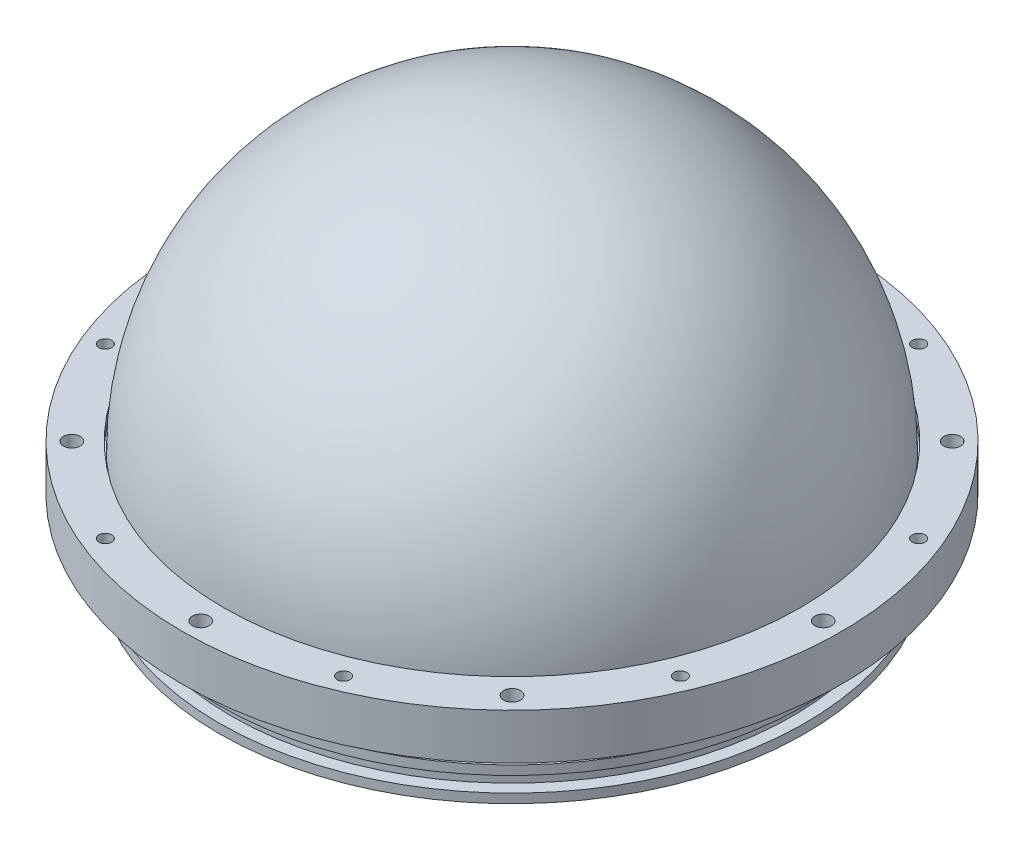
ISO-10303-21;
HEADER;
FILE_DESCRIPTION(('STEP AP214'),'2;1');
FILE_NAME('part.step','',(''),(''),'','','');
FILE_SCHEMA(('AUTOMOTIVE_DESIGN { 1 0 10303 214 1 1 1 1 }'));
ENDSEC;
DATA;
#1=APPLICATION_CONTEXT('core data for automotive mechanical design processes');
#2=APPLICATION_PROTOCOL_DEFINITION('international standard','automotive_design',2000,#1);
#3=PRODUCT_CONTEXT('',#1,'mechanical');
#4=PRODUCT('Part','Part','',(#3));
#5=PRODUCT_RELATED_PRODUCT_CATEGORY('part','',(#4));
#6=PRODUCT_DEFINITION_FORMATION('','',#4);
#7=PRODUCT_DEFINITION_CONTEXT('part definition',#1,'design');
#8=PRODUCT_DEFINITION('design','',#6,#7);
#9=PRODUCT_DEFINITION_SHAPE('','',#8);
#10=(LENGTH_UNIT() NAMED_UNIT(*) SI_UNIT(.MILLI.,.METRE.));
#11=(NAMED_UNIT(*) PLANE_ANGLE_UNIT() SI_UNIT($,.RADIAN.));
#12=(NAMED_UNIT(*) SI_UNIT($,.STERADIAN.) SOLID_ANGLE_UNIT());
#13=UNCERTAINTY_MEASURE_WITH_UNIT(LENGTH_MEASURE(1.E-05),#10,'distance_accuracy_value','');
#14=(GEOMETRIC_REPRESENTATION_CONTEXT(3) GLOBAL_UNCERTAINTY_ASSIGNED_CONTEXT((#13)) GLOBAL_UNIT_ASSIGNED_CONTEXT((#10,
#11,#12)) REPRESENTATION_CONTEXT('',''));
#15=CARTESIAN_POINT('',(0.,0.,0.));
#16=DIRECTION('',(0.,0.,1.));
#17=DIRECTION('',(1.,0.,0.));
#18=AXIS2_PLACEMENT_3D('',#15,#16,#17);
#19=CARTESIAN_POINT('',(0.,14.5,0.));
#20=DIRECTION('',(0.,1.,0.));
#21=DIRECTION('',(1.,0.,0.));
#22=AXIS2_PLACEMENT_3D('',#19,#20,#21);
#23=SPHERICAL_SURFACE('',#22,94.);
#24=CARTESIAN_POINT('',(0.,14.5,0.));
#25=DIRECTION('',(0.,1.,0.));
#26=DIRECTION('',(-1.,0.,0.));
#27=AXIS2_PLACEMENT_3D('',#24,#25,#26);
#28=CIRCLE('',#27,94.);
#29=CARTESIAN_POINT('',(-94.,14.5,0.));
#30=VERTEX_POINT('',#29);
#31=EDGE_CURVE('E11',#30,#30,#28,.T.);
#32=ORIENTED_EDGE('',*,*,#31,.T.);
#33=EDGE_LOOP('',(#32));
#34=FACE_BOUND('',#33,.T.);
#35=ADVANCED_FACE('F41',(#34),#23,.T.);
#36=CARTESIAN_POINT('',(87.65,14.5,0.));
#37=DIRECTION('',(0.,1.,0.));
#38=DIRECTION('',(-1.,0.,0.));
#39=AXIS2_PLACEMENT_3D('',#36,#37,#38);
#40=PLANE('',#39);
#41=ORIENTED_EDGE('',*,*,#31,.F.);
#42=EDGE_LOOP('',(#41));
#43=FACE_BOUND('',#42,.T.);
#44=CARTESIAN_POINT('',(0.,14.5,0.));
#45=DIRECTION('',(0.,1.,0.));
#46=DIRECTION('',(-1.,0.,0.));
#47=AXIS2_PLACEMENT_3D('',#44,#45,#46);
#48=CIRCLE('',#47,87.65);
#49=CARTESIAN_POINT('',(-87.65,14.5,0.));
#50=VERTEX_POINT('',#49);
#51=EDGE_CURVE('E47',#50,#50,#48,.T.);
#52=ORIENTED_EDGE('',*,*,#51,.T.);
#53=EDGE_LOOP('',(#52));
#54=FACE_BOUND('',#53,.T.);
#55=ADVANCED_FACE('F53',(#43,#54),#40,.F.);
#56=CARTESIAN_POINT('',(0.,14.5,0.));
#57=DIRECTION('',(0.,1.,0.));
#58=DIRECTION('',(1.,0.,0.));
#59=AXIS2_PLACEMENT_3D('',#56,#57,#58);
#60=SPHERICAL_SURFACE('',#59,87.65);
#61=ORIENTED_EDGE('',*,*,#51,.F.);
#62=EDGE_LOOP('',(#61));
#63=FACE_BOUND('',#62,.T.);
#64=ADVANCED_FACE('F55',(#63),#60,.F.);
#65=CLOSED_SHELL('',(#35,#55,#64));
#66=MANIFOLD_SOLID_BREP('B2',#65);
#67=CARTESIAN_POINT('',(94.5,17.5,0.));
#68=DIRECTION('',(0.,-1.,0.));
#69=DIRECTION('',(0.,0.,-1.));
#70=AXIS2_PLACEMENT_3D('',#67,#68,#69);
#71=PLANE('',#70);
#72=CARTESIAN_POINT('',(94.2357123161512,17.5,-39.0337101012392));
#73=DIRECTION('',(0.,1.,0.));
#74=DIRECTION('',(0.,0.,1.));
#75=AXIS2_PLACEMENT_3D('',#72,#73,#74);
#76=CIRCLE('',#75,2.1);
#77=CARTESIAN_POINT('',(94.2357123161512,17.5,-36.9337101012392));
#78=VERTEX_POINT('',#77);
#79=EDGE_CURVE('E243',#78,#78,#76,.T.);
#80=ORIENTED_EDGE('',*,*,#79,.F.);
#81=EDGE_LOOP('',(#80));
#82=FACE_BOUND('',#81,.T.);
#83=CARTESIAN_POINT('',(-39.0337101012393,17.5,-94.2357123161512));
#84=DIRECTION('',(0.,1.,0.));
#85=DIRECTION('',(0.,0.,1.));
#86=AXIS2_PLACEMENT_3D('',#83,#84,#85);
#87=CIRCLE('',#86,2.1);
#88=CARTESIAN_POINT('',(-39.0337101012393,17.5,-92.1357123161512));
#89=VERTEX_POINT('',#88);
#90=EDGE_CURVE('E207',#89,#89,#87,.T.);
#91=ORIENTED_EDGE('',*,*,#90,.F.);
#92=EDGE_LOOP('',(#91));
#93=FACE_BOUND('',#92,.T.);
#94=CARTESIAN_POINT('',(39.0337101012391,17.5,-94.2357123161513));
#95=DIRECTION('',(0.,1.,0.));
#96=DIRECTION('',(0.,0.,1.));
#97=AXIS2_PLACEMENT_3D('',#94,#95,#96);
#98=CIRCLE('',#97,2.1);
#99=CARTESIAN_POINT('',(39.0337101012391,17.5,-92.1357123161513));
#100=VERTEX_POINT('',#99);
#101=EDGE_CURVE('E201',#100,#100,#98,.T.);
#102=ORIENTED_EDGE('',*,*,#101,.F.);
#103=EDGE_LOOP('',(#102));
#104=FACE_BOUND('',#103,.T.);
#105=CARTESIAN_POINT('',(102.,17.5,0.));
#106=DIRECTION('',(0.,1.,0.));
#107=DIRECTION('',(0.,0.,1.));
#108=AXIS2_PLACEMENT_3D('',#105,#106,#107);
#109=CIRCLE('',#108,2.75);
#110=CARTESIAN_POINT('',(102.,17.5,2.75000000000003));
#111=VERTEX_POINT('',#110);
#112=EDGE_CURVE('E195',#111,#111,#109,.T.);
#113=ORIENTED_EDGE('',*,*,#112,.F.);
#114=EDGE_LOOP('',(#113));
#115=FACE_BOUND('',#114,.T.);
#116=CARTESIAN_POINT('',(72.1248916810279,17.5,72.1248916810279));
#117=DIRECTION('',(0.,1.,0.));
#118=DIRECTION('',(0.,0.,1.));
#119=AXIS2_PLACEMENT_3D('',#116,#117,#118);
#120=CIRCLE('',#119,2.75);
#121=CARTESIAN_POINT('',(72.1248916810279,17.5,74.8748916810279));
#122=VERTEX_POINT('',#121);
#123=EDGE_CURVE('E189',#122,#122,#120,.T.);
#124=ORIENTED_EDGE('',*,*,#123,.F.);
#125=EDGE_LOOP('',(#124));
#126=FACE_BOUND('',#125,.T.);
#127=CARTESIAN_POINT('',(0.,17.5,102.));
#128=DIRECTION('',(0.,1.,0.));
#129=DIRECTION('',(0.,0.,1.));
#130=AXIS2_PLACEMENT_3D('',#127,#128,#129);
#131=CIRCLE('',#130,2.75);
#132=CARTESIAN_POINT('',(0.,17.5,104.75));
#133=VERTEX_POINT('',#132);
#134=EDGE_CURVE('E183',#133,#133,#131,.T.);
#135=ORIENTED_EDGE('',*,*,#134,.F.);
#136=EDGE_LOOP('',(#135));
#137=FACE_BOUND('',#136,.T.);
#138=CARTESIAN_POINT('',(-102.,17.5,0.));
#139=DIRECTION('',(0.,1.,0.));
#140=DIRECTION('',(0.,0.,1.));
#141=AXIS2_PLACEMENT_3D('',#138,#139,#140);
#142=CIRCLE('',#141,2.75);
#143=CARTESIAN_POINT('',(-102.,17.5,2.75000000000003));
#144=VERTEX_POINT('',#143);
#145=EDGE_CURVE('E171',#144,#144,#142,.T.);
#146=ORIENTED_EDGE('',*,*,#145,.F.);
#147=EDGE_LOOP('',(#146));
#148=FACE_BOUND('',#147,.T.);
#149=CARTESIAN_POINT('',(-72.1248916810279,17.5,-72.1248916810278));
#150=DIRECTION('',(0.,1.,0.));
#151=DIRECTION('',(0.,0.,1.));
#152=AXIS2_PLACEMENT_3D('',#149,#150,#151);
#153=CIRCLE('',#152,2.75);
#154=CARTESIAN_POINT('',(-72.1248916810279,17.5,-69.3748916810278));
#155=VERTEX_POINT('',#154);
#156=EDGE_CURVE('E165',#155,#155,#153,.T.);
#157=ORIENTED_EDGE('',*,*,#156,.F.);
#158=EDGE_LOOP('',(#157));
#159=FACE_BOUND('',#158,.T.);
#160=CARTESIAN_POINT('',(0.,17.5,-102.));
#161=DIRECTION('',(0.,1.,0.));
#162=DIRECTION('',(0.,0.,1.));
#163=AXIS2_PLACEMENT_3D('',#160,#161,#162);
#164=CIRCLE('',#163,2.75);
#165=CARTESIAN_POINT('',(0.,17.5,-99.25));
#166=VERTEX_POINT('',#165);
#167=EDGE_CURVE('E159',#166,#166,#164,.T.);
#168=ORIENTED_EDGE('',*,*,#167,.F.);
#169=EDGE_LOOP('',(#168));
#170=FACE_BOUND('',#169,.T.);
#171=CARTESIAN_POINT('',(0.,17.5,0.));
#172=DIRECTION('',(0.,1.,0.));
#173=DIRECTION('',(0.,0.,1.));
#174=AXIS2_PLACEMENT_3D('',#171,#172,#173);
#175=CIRCLE('',#174,94.5);
#176=CARTESIAN_POINT('',(0.,17.5,94.5));
#177=VERTEX_POINT('',#176);
#178=EDGE_CURVE('E111',#177,#177,#175,.T.);
#179=ORIENTED_EDGE('',*,*,#178,.F.);
#180=EDGE_LOOP('',(#179));
#181=FACE_BOUND('',#180,.T.);
#182=CARTESIAN_POINT('',(0.,17.5,0.));
#183=DIRECTION('',(0.,1.,0.));
#184=DIRECTION('',(0.,0.,1.));
#185=AXIS2_PLACEMENT_3D('',#182,#183,#184);
#186=CIRCLE('',#185,108.);
#187=CARTESIAN_POINT('',(0.,17.5,108.));
#188=VERTEX_POINT('',#187);
#189=EDGE_CURVE('E114',#188,#188,#186,.T.);
#190=ORIENTED_EDGE('',*,*,#189,.T.);
#191=EDGE_LOOP('',(#190));
#192=FACE_BOUND('',#191,.T.);
#193=CARTESIAN_POINT('',(72.1248916810279,17.5,-72.1248916810278));
#194=DIRECTION('',(0.,1.,0.));
#195=DIRECTION('',(0.,0.,1.));
#196=AXIS2_PLACEMENT_3D('',#193,#194,#195);
#197=CIRCLE('',#196,2.75);
#198=CARTESIAN_POINT('',(72.1248916810279,17.5,-69.3748916810278));
#199=VERTEX_POINT('',#198);
#200=EDGE_CURVE('E153',#199,#199,#197,.T.);
#201=ORIENTED_EDGE('',*,*,#200,.F.);
#202=EDGE_LOOP('',(#201));
#203=FACE_BOUND('',#202,.T.);
#204=CARTESIAN_POINT('',(-72.1248916810278,17.5,72.1248916810279));
#205=DIRECTION('',(0.,1.,0.));
#206=DIRECTION('',(0.,0.,1.));
#207=AXIS2_PLACEMENT_3D('',#204,#205,#206);
#208=CIRCLE('',#207,2.75);
#209=CARTESIAN_POINT('',(-72.1248916810278,17.5,74.8748916810279));
#210=VERTEX_POINT('',#209);
#211=EDGE_CURVE('E177',#210,#210,#208,.T.);
#212=ORIENTED_EDGE('',*,*,#211,.F.);
#213=EDGE_LOOP('',(#212));
#214=FACE_BOUND('',#213,.T.);
#215=CARTESIAN_POINT('',(-94.2357123161513,17.5,-39.033710101239));
#216=DIRECTION('',(0.,1.,0.));
#217=DIRECTION('',(0.,0.,1.));
#218=AXIS2_PLACEMENT_3D('',#215,#216,#217);
#219=CIRCLE('',#218,2.1);
#220=CARTESIAN_POINT('',(-94.2357123161513,17.5,-36.933710101239));
#221=VERTEX_POINT('',#220);
#222=EDGE_CURVE('E213',#221,#221,#219,.T.);
#223=ORIENTED_EDGE('',*,*,#222,.F.);
#224=EDGE_LOOP('',(#223));
#225=FACE_BOUND('',#224,.T.);
#226=CARTESIAN_POINT('',(-94.2357123161512,17.5,39.0337101012393));
#227=DIRECTION('',(0.,1.,0.));
#228=DIRECTION('',(0.,0.,1.));
#229=AXIS2_PLACEMENT_3D('',#226,#227,#228);
#230=CIRCLE('',#229,2.1);
#231=CARTESIAN_POINT('',(-94.2357123161512,17.5,41.1337101012393));
#232=VERTEX_POINT('',#231);
#233=EDGE_CURVE('E219',#232,#232,#230,.T.);
#234=ORIENTED_EDGE('',*,*,#233,.F.);
#235=EDGE_LOOP('',(#234));
#236=FACE_BOUND('',#235,.T.);
#237=CARTESIAN_POINT('',(-39.033710101239,17.5,94.2357123161513));
#238=DIRECTION('',(0.,1.,0.));
#239=DIRECTION('',(0.,0.,1.));
#240=AXIS2_PLACEMENT_3D('',#237,#238,#239);
#241=CIRCLE('',#240,2.1);
#242=CARTESIAN_POINT('',(-39.033710101239,17.5,96.3357123161513));
#243=VERTEX_POINT('',#242);
#244=EDGE_CURVE('E225',#243,#243,#241,.T.);
#245=ORIENTED_EDGE('',*,*,#244,.F.);
#246=EDGE_LOOP('',(#245));
#247=FACE_BOUND('',#246,.T.);
#248=CARTESIAN_POINT('',(39.0337101012393,17.5,94.2357123161512));
#249=DIRECTION('',(0.,1.,0.));
#250=DIRECTION('',(0.,0.,1.));
#251=AXIS2_PLACEMENT_3D('',#248,#249,#250);
#252=CIRCLE('',#251,2.1);
#253=CARTESIAN_POINT('',(39.0337101012393,17.5,96.3357123161512));
#254=VERTEX_POINT('',#253);
#255=EDGE_CURVE('E231',#254,#254,#252,.T.);
#256=ORIENTED_EDGE('',*,*,#255,.F.);
#257=EDGE_LOOP('',(#256));
#258=FACE_BOUND('',#257,.T.);
#259=CARTESIAN_POINT('',(94.2357123161513,17.5,39.0337101012391));
#260=DIRECTION('',(0.,1.,0.));
#261=DIRECTION('',(0.,0.,1.));
#262=AXIS2_PLACEMENT_3D('',#259,#260,#261);
#263=CIRCLE('',#262,2.1);
#264=CARTESIAN_POINT('',(94.2357123161513,17.5,41.1337101012391));
#265=VERTEX_POINT('',#264);
#266=EDGE_CURVE('E237',#265,#265,#263,.T.);
#267=ORIENTED_EDGE('',*,*,#266,.F.);
#268=EDGE_LOOP('',(#267));
#269=FACE_BOUND('',#268,.T.);
#270=ADVANCED_FACE('F82',(#82,#93,#104,#115,#126,#137,#148,#159,#170,#181,#192,#203,#214,#225,
#236,#247,#258,#269),#71,.F.);
#271=CARTESIAN_POINT('',(96.,-17.5,0.));
#272=DIRECTION('',(0.,1.,0.));
#273=DIRECTION('',(0.,0.,1.));
#274=AXIS2_PLACEMENT_3D('',#271,#272,#273);
#275=PLANE('',#274);
#276=CARTESIAN_POINT('',(0.,-17.5,0.));
#277=DIRECTION('',(0.,1.,0.));
#278=DIRECTION('',(0.,0.,1.));
#279=AXIS2_PLACEMENT_3D('',#276,#277,#278);
#280=CIRCLE('',#279,96.);
#281=CARTESIAN_POINT('',(0.,-17.5,96.));
#282=VERTEX_POINT('',#281);
#283=EDGE_CURVE('E147',#282,#282,#280,.T.);
#284=ORIENTED_EDGE('',*,*,#283,.F.);
#285=EDGE_LOOP('',(#284));
#286=FACE_BOUND('',#285,.T.);
#287=CARTESIAN_POINT('',(0.,-17.5,0.));
#288=DIRECTION('',(0.,1.,0.));
#289=DIRECTION('',(0.,0.,1.));
#290=AXIS2_PLACEMENT_3D('',#287,#288,#289);
#291=CIRCLE('',#290,78.5);
#292=CARTESIAN_POINT('',(0.,-17.5,78.5));
#293=VERTEX_POINT('',#292);
#294=EDGE_CURVE('E40',#293,#293,#291,.T.);
#295=ORIENTED_EDGE('',*,*,#294,.T.);
#296=EDGE_LOOP('',(#295));
#297=FACE_BOUND('',#296,.T.);
#298=ADVANCED_FACE('F84',(#286,#297),#275,.F.);
#299=CARTESIAN_POINT('',(0.,17.5,0.));
#300=DIRECTION('',(0.,1.,0.));
#301=DIRECTION('',(0.,0.,1.));
#302=AXIS2_PLACEMENT_3D('',#299,#300,#301);
#303=CYLINDRICAL_SURFACE('',#302,78.5);
#304=ORIENTED_EDGE('',*,*,#294,.F.);
#305=EDGE_LOOP('',(#304));
#306=FACE_BOUND('',#305,.T.);
#307=CARTESIAN_POINT('',(0.,2.5,0.));
#308=DIRECTION('',(0.,1.,0.));
#309=DIRECTION('',(0.,0.,1.));
#310=AXIS2_PLACEMENT_3D('',#307,#308,#309);
#311=CIRCLE('',#310,78.5);
#312=CARTESIAN_POINT('',(0.,2.5,78.5));
#313=VERTEX_POINT('',#312);
#314=EDGE_CURVE('E89',#313,#313,#311,.T.);
#315=ORIENTED_EDGE('',*,*,#314,.T.);
#316=EDGE_LOOP('',(#315));
#317=FACE_BOUND('',#316,.T.);
#318=ADVANCED_FACE('F419',(#306,#317),#303,.F.);
#319=CARTESIAN_POINT('',(78.5,2.5,0.));
#320=DIRECTION('',(0.,1.,0.));
#321=DIRECTION('',(0.,0.,1.));
#322=AXIS2_PLACEMENT_3D('',#319,#320,#321);
#323=PLANE('',#322);
#324=ORIENTED_EDGE('',*,*,#314,.F.);
#325=EDGE_LOOP('',(#324));
#326=FACE_BOUND('',#325,.T.);
#327=CARTESIAN_POINT('',(0.,2.5,0.));
#328=DIRECTION('',(0.,1.,0.));
#329=DIRECTION('',(0.,0.,1.));
#330=AXIS2_PLACEMENT_3D('',#327,#328,#329);
#331=CIRCLE('',#330,73.5);
#332=CARTESIAN_POINT('',(0.,2.5,73.5));
#333=VERTEX_POINT('',#332);
#334=EDGE_CURVE('E93',#333,#333,#331,.T.);
#335=ORIENTED_EDGE('',*,*,#334,.T.);
#336=EDGE_LOOP('',(#335));
#337=FACE_BOUND('',#336,.T.);
#338=ADVANCED_FACE('F416',(#326,#337),#323,.F.);
#339=CARTESIAN_POINT('',(0.,17.5,0.));
#340=DIRECTION('',(0.,1.,0.));
#341=DIRECTION('',(0.,0.,1.));
#342=AXIS2_PLACEMENT_3D('',#339,#340,#341);
#343=CYLINDRICAL_SURFACE('',#342,73.5);
#344=ORIENTED_EDGE('',*,*,#334,.F.);
#345=EDGE_LOOP('',(#344));
#346=FACE_BOUND('',#345,.T.);
#347=CARTESIAN_POINT('',(0.,6.5,0.));
#348=DIRECTION('',(0.,1.,0.));
#349=DIRECTION('',(0.,0.,1.));
#350=AXIS2_PLACEMENT_3D('',#347,#348,#349);
#351=CIRCLE('',#350,73.5);
#352=CARTESIAN_POINT('',(0.,6.5,73.5));
#353=VERTEX_POINT('',#352);
#354=EDGE_CURVE('E97',#353,#353,#351,.T.);
#355=ORIENTED_EDGE('',*,*,#354,.T.);
#356=EDGE_LOOP('',(#355));
#357=FACE_BOUND('',#356,.T.);
#358=ADVANCED_FACE('F412',(#346,#357),#343,.F.);
#359=CARTESIAN_POINT('',(73.5,6.5,0.));
#360=DIRECTION('',(0.,-1.,0.));
#361=DIRECTION('',(0.,0.,-1.));
#362=AXIS2_PLACEMENT_3D('',#359,#360,#361);
#363=PLANE('',#362);
#364=ORIENTED_EDGE('',*,*,#354,.F.);
#365=EDGE_LOOP('',(#364));
#366=FACE_BOUND('',#365,.T.);
#367=CARTESIAN_POINT('',(0.,6.5,0.));
#368=DIRECTION('',(0.,1.,0.));
#369=DIRECTION('',(0.,0.,1.));
#370=AXIS2_PLACEMENT_3D('',#367,#368,#369);
#371=CIRCLE('',#370,78.5);
#372=CARTESIAN_POINT('',(0.,6.5,78.5));
#373=VERTEX_POINT('',#372);
#374=EDGE_CURVE('E102',#373,#373,#371,.T.);
#375=ORIENTED_EDGE('',*,*,#374,.T.);
#376=EDGE_LOOP('',(#375));
#377=FACE_BOUND('',#376,.T.);
#378=ADVANCED_FACE('F408',(#366,#377),#363,.F.);
#379=CARTESIAN_POINT('',(0.,17.5,0.));
#380=DIRECTION('',(0.,1.,0.));
#381=DIRECTION('',(0.,0.,1.));
#382=AXIS2_PLACEMENT_3D('',#379,#380,#381);
#383=CYLINDRICAL_SURFACE('',#382,78.5);
#384=ORIENTED_EDGE('',*,*,#374,.F.);
#385=EDGE_LOOP('',(#384));
#386=FACE_BOUND('',#385,.T.);
#387=CARTESIAN_POINT('',(0.,14.5,0.));
#388=DIRECTION('',(0.,1.,0.));
#389=DIRECTION('',(0.,0.,1.));
#390=AXIS2_PLACEMENT_3D('',#387,#388,#389);
#391=CIRCLE('',#390,78.5);
#392=CARTESIAN_POINT('',(0.,14.5,78.5));
#393=VERTEX_POINT('',#392);
#394=EDGE_CURVE('E105',#393,#393,#391,.T.);
#395=ORIENTED_EDGE('',*,*,#394,.T.);
#396=EDGE_LOOP('',(#395));
#397=FACE_BOUND('',#396,.T.);
#398=ADVANCED_FACE('F404',(#386,#397),#383,.F.);
#399=CARTESIAN_POINT('',(78.5,14.5,0.));
#400=DIRECTION('',(0.,-1.,0.));
#401=DIRECTION('',(0.,0.,-1.));
#402=AXIS2_PLACEMENT_3D('',#399,#400,#401);
#403=PLANE('',#402);
#404=ORIENTED_EDGE('',*,*,#394,.F.);
#405=EDGE_LOOP('',(#404));
#406=FACE_BOUND('',#405,.T.);
#407=CARTESIAN_POINT('',(0.,14.5,0.));
#408=DIRECTION('',(0.,1.,0.));
#409=DIRECTION('',(0.,0.,1.));
#410=AXIS2_PLACEMENT_3D('',#407,#408,#409);
#411=CIRCLE('',#410,94.5);
#412=CARTESIAN_POINT('',(0.,14.5,94.5));
#413=VERTEX_POINT('',#412);
#414=EDGE_CURVE('E108',#413,#413,#411,.T.);
#415=ORIENTED_EDGE('',*,*,#414,.T.);
#416=EDGE_LOOP('',(#415));
#417=FACE_BOUND('',#416,.T.);
#418=ADVANCED_FACE('F400',(#406,#417),#403,.F.);
#419=CARTESIAN_POINT('',(0.,17.5,0.));
#420=DIRECTION('',(0.,1.,0.));
#421=DIRECTION('',(0.,0.,1.));
#422=AXIS2_PLACEMENT_3D('',#419,#420,#421);
#423=CYLINDRICAL_SURFACE('',#422,94.5);
#424=ORIENTED_EDGE('',*,*,#414,.F.);
#425=EDGE_LOOP('',(#424));
#426=FACE_BOUND('',#425,.T.);
#427=ORIENTED_EDGE('',*,*,#178,.T.);
#428=EDGE_LOOP('',(#427));
#429=FACE_BOUND('',#428,.T.);
#430=ADVANCED_FACE('F395',(#426,#429),#423,.F.);
#431=CARTESIAN_POINT('',(0.,17.5,0.));
#432=DIRECTION('',(0.,1.,0.));
#433=DIRECTION('',(0.,0.,1.));
#434=AXIS2_PLACEMENT_3D('',#431,#432,#433);
#435=CYLINDRICAL_SURFACE('',#434,108.);
#436=ORIENTED_EDGE('',*,*,#189,.F.);
#437=EDGE_LOOP('',(#436));
#438=FACE_BOUND('',#437,.T.);
#439=CARTESIAN_POINT('',(0.,2.5,0.));
#440=DIRECTION('',(0.,1.,0.));
#441=DIRECTION('',(0.,0.,1.));
#442=AXIS2_PLACEMENT_3D('',#439,#440,#441);
#443=CIRCLE('',#442,108.);
#444=CARTESIAN_POINT('',(0.,2.5,108.));
#445=VERTEX_POINT('',#444);
#446=EDGE_CURVE('E117',#445,#445,#443,.T.);
#447=ORIENTED_EDGE('',*,*,#446,.T.);
#448=EDGE_LOOP('',(#447));
#449=FACE_BOUND('',#448,.T.);
#450=ADVANCED_FACE('F392',(#438,#449),#435,.T.);
#451=CARTESIAN_POINT('',(96.,2.5,0.));
#452=DIRECTION('',(0.,1.,0.));
#453=DIRECTION('',(0.,0.,1.));
#454=AXIS2_PLACEMENT_3D('',#451,#452,#453);
#455=PLANE('',#454);
#456=CARTESIAN_POINT('',(94.2357123161512,2.5,-39.0337101012392));
#457=DIRECTION('',(0.,1.,0.));
#458=DIRECTION('',(0.,0.,1.));
#459=AXIS2_PLACEMENT_3D('',#456,#457,#458);
#460=CIRCLE('',#459,2.1);
#461=CARTESIAN_POINT('',(94.2357123161512,2.5,-36.9337101012392));
#462=VERTEX_POINT('',#461);
#463=EDGE_CURVE('E240',#462,#462,#460,.T.);
#464=ORIENTED_EDGE('',*,*,#463,.T.);
#465=EDGE_LOOP('',(#464));
#466=FACE_BOUND('',#465,.T.);
#467=CARTESIAN_POINT('',(94.2357123161513,2.5,39.0337101012391));
#468=DIRECTION('',(0.,1.,0.));
#469=DIRECTION('',(0.,0.,1.));
#470=AXIS2_PLACEMENT_3D('',#467,#468,#469);
#471=CIRCLE('',#470,2.1);
#472=CARTESIAN_POINT('',(94.2357123161513,2.5,41.1337101012391));
#473=VERTEX_POINT('',#472);
#474=EDGE_CURVE('E234',#473,#473,#471,.T.);
#475=ORIENTED_EDGE('',*,*,#474,.T.);
#476=EDGE_LOOP('',(#475));
#477=FACE_BOUND('',#476,.T.);
#478=CARTESIAN_POINT('',(39.0337101012393,2.5,94.2357123161512));
#479=DIRECTION('',(0.,1.,0.));
#480=DIRECTION('',(0.,0.,1.));
#481=AXIS2_PLACEMENT_3D('',#478,#479,#480);
#482=CIRCLE('',#481,2.1);
#483=CARTESIAN_POINT('',(39.0337101012393,2.5,96.3357123161512));
#484=VERTEX_POINT('',#483);
#485=EDGE_CURVE('E228',#484,#484,#482,.T.);
#486=ORIENTED_EDGE('',*,*,#485,.T.);
#487=EDGE_LOOP('',(#486));
#488=FACE_BOUND('',#487,.T.);
#489=CARTESIAN_POINT('',(-39.033710101239,2.5,94.2357123161513));
#490=DIRECTION('',(0.,1.,0.));
#491=DIRECTION('',(0.,0.,1.));
#492=AXIS2_PLACEMENT_3D('',#489,#490,#491);
#493=CIRCLE('',#492,2.1);
#494=CARTESIAN_POINT('',(-39.033710101239,2.5,96.3357123161513));
#495=VERTEX_POINT('',#494);
#496=EDGE_CURVE('E222',#495,#495,#493,.T.);
#497=ORIENTED_EDGE('',*,*,#496,.T.);
#498=EDGE_LOOP('',(#497));
#499=FACE_BOUND('',#498,.T.);
#500=CARTESIAN_POINT('',(-94.2357123161512,2.5,39.0337101012393));
#501=DIRECTION('',(0.,1.,0.));
#502=DIRECTION('',(0.,0.,1.));
#503=AXIS2_PLACEMENT_3D('',#500,#501,#502);
#504=CIRCLE('',#503,2.1);
#505=CARTESIAN_POINT('',(-94.2357123161512,2.5,41.1337101012393));
#506=VERTEX_POINT('',#505);
#507=EDGE_CURVE('E216',#506,#506,#504,.T.);
#508=ORIENTED_EDGE('',*,*,#507,.T.);
#509=EDGE_LOOP('',(#508));
#510=FACE_BOUND('',#509,.T.);
#511=CARTESIAN_POINT('',(-94.2357123161513,2.5,-39.033710101239));
#512=DIRECTION('',(0.,1.,0.));
#513=DIRECTION('',(0.,0.,1.));
#514=AXIS2_PLACEMENT_3D('',#511,#512,#513);
#515=CIRCLE('',#514,2.1);
#516=CARTESIAN_POINT('',(-94.2357123161513,2.5,-36.933710101239));
#517=VERTEX_POINT('',#516);
#518=EDGE_CURVE('E210',#517,#517,#515,.T.);
#519=ORIENTED_EDGE('',*,*,#518,.T.);
#520=EDGE_LOOP('',(#519));
#521=FACE_BOUND('',#520,.T.);
#522=CARTESIAN_POINT('',(-39.0337101012393,2.5,-94.2357123161512));
#523=DIRECTION('',(0.,1.,0.));
#524=DIRECTION('',(0.,0.,1.));
#525=AXIS2_PLACEMENT_3D('',#522,#523,#524);
#526=CIRCLE('',#525,2.1);
#527=CARTESIAN_POINT('',(-39.0337101012393,2.5,-92.1357123161512));
#528=VERTEX_POINT('',#527);
#529=EDGE_CURVE('E204',#528,#528,#526,.T.);
#530=ORIENTED_EDGE('',*,*,#529,.T.);
#531=EDGE_LOOP('',(#530));
#532=FACE_BOUND('',#531,.T.);
#533=CARTESIAN_POINT('',(39.0337101012391,2.5,-94.2357123161513));
#534=DIRECTION('',(0.,1.,0.));
#535=DIRECTION('',(0.,0.,1.));
#536=AXIS2_PLACEMENT_3D('',#533,#534,#535);
#537=CIRCLE('',#536,2.1);
#538=CARTESIAN_POINT('',(39.0337101012391,2.5,-92.1357123161513));
#539=VERTEX_POINT('',#538);
#540=EDGE_CURVE('E198',#539,#539,#537,.T.);
#541=ORIENTED_EDGE('',*,*,#540,.T.);
#542=EDGE_LOOP('',(#541));
#543=FACE_BOUND('',#542,.T.);
#544=CARTESIAN_POINT('',(102.,2.5,0.));
#545=DIRECTION('',(0.,1.,0.));
#546=DIRECTION('',(0.,0.,1.));
#547=AXIS2_PLACEMENT_3D('',#544,#545,#546);
#548=CIRCLE('',#547,2.75);
#549=CARTESIAN_POINT('',(102.,2.5,2.75000000000003));
#550=VERTEX_POINT('',#549);
#551=EDGE_CURVE('E192',#550,#550,#548,.T.);
#552=ORIENTED_EDGE('',*,*,#551,.T.);
#553=EDGE_LOOP('',(#552));
#554=FACE_BOUND('',#553,.T.);
#555=CARTESIAN_POINT('',(72.1248916810279,2.5,72.1248916810279));
#556=DIRECTION('',(0.,1.,0.));
#557=DIRECTION('',(0.,0.,1.));
#558=AXIS2_PLACEMENT_3D('',#555,#556,#557);
#559=CIRCLE('',#558,2.75);
#560=CARTESIAN_POINT('',(72.1248916810279,2.5,74.8748916810279));
#561=VERTEX_POINT('',#560);
#562=EDGE_CURVE('E186',#561,#561,#559,.T.);
#563=ORIENTED_EDGE('',*,*,#562,.T.);
#564=EDGE_LOOP('',(#563));
#565=FACE_BOUND('',#564,.T.);
#566=CARTESIAN_POINT('',(0.,2.5,102.));
#567=DIRECTION('',(0.,1.,0.));
#568=DIRECTION('',(0.,0.,1.));
#569=AXIS2_PLACEMENT_3D('',#566,#567,#568);
#570=CIRCLE('',#569,2.75);
#571=CARTESIAN_POINT('',(0.,2.5,104.75));
#572=VERTEX_POINT('',#571);
#573=EDGE_CURVE('E180',#572,#572,#570,.T.);
#574=ORIENTED_EDGE('',*,*,#573,.T.);
#575=EDGE_LOOP('',(#574));
#576=FACE_BOUND('',#575,.T.);
#577=CARTESIAN_POINT('',(-72.1248916810278,2.5,72.1248916810279));
#578=DIRECTION('',(0.,1.,0.));
#579=DIRECTION('',(0.,0.,1.));
#580=AXIS2_PLACEMENT_3D('',#577,#578,#579);
#581=CIRCLE('',#580,2.75);
#582=CARTESIAN_POINT('',(-72.1248916810278,2.5,74.8748916810279));
#583=VERTEX_POINT('',#582);
#584=EDGE_CURVE('E174',#583,#583,#581,.T.);
#585=ORIENTED_EDGE('',*,*,#584,.T.);
#586=EDGE_LOOP('',(#585));
#587=FACE_BOUND('',#586,.T.);
#588=CARTESIAN_POINT('',(-102.,2.5,0.));
#589=DIRECTION('',(0.,1.,0.));
#590=DIRECTION('',(0.,0.,1.));
#591=AXIS2_PLACEMENT_3D('',#588,#589,#590);
#592=CIRCLE('',#591,2.75);
#593=CARTESIAN_POINT('',(-102.,2.5,2.75000000000003));
#594=VERTEX_POINT('',#593);
#595=EDGE_CURVE('E168',#594,#594,#592,.T.);
#596=ORIENTED_EDGE('',*,*,#595,.T.);
#597=EDGE_LOOP('',(#596));
#598=FACE_BOUND('',#597,.T.);
#599=CARTESIAN_POINT('',(-72.1248916810279,2.5,-72.1248916810278));
#600=DIRECTION('',(0.,1.,0.));
#601=DIRECTION('',(0.,0.,1.));
#602=AXIS2_PLACEMENT_3D('',#599,#600,#601);
#603=CIRCLE('',#602,2.75);
#604=CARTESIAN_POINT('',(-72.1248916810279,2.5,-69.3748916810278));
#605=VERTEX_POINT('',#604);
#606=EDGE_CURVE('E162',#605,#605,#603,.T.);
#607=ORIENTED_EDGE('',*,*,#606,.T.);
#608=EDGE_LOOP('',(#607));
#609=FACE_BOUND('',#608,.T.);
#610=CARTESIAN_POINT('',(0.,2.5,-102.));
#611=DIRECTION('',(0.,1.,0.));
#612=DIRECTION('',(0.,0.,1.));
#613=AXIS2_PLACEMENT_3D('',#610,#611,#612);
#614=CIRCLE('',#613,2.75);
#615=CARTESIAN_POINT('',(0.,2.5,-99.25));
#616=VERTEX_POINT('',#615);
#617=EDGE_CURVE('E156',#616,#616,#614,.T.);
#618=ORIENTED_EDGE('',*,*,#617,.T.);
#619=EDGE_LOOP('',(#618));
#620=FACE_BOUND('',#619,.T.);
#621=CARTESIAN_POINT('',(72.1248916810279,2.5,-72.1248916810278));
#622=DIRECTION('',(0.,1.,0.));
#623=DIRECTION('',(0.,0.,1.));
#624=AXIS2_PLACEMENT_3D('',#621,#622,#623);
#625=CIRCLE('',#624,2.75);
#626=CARTESIAN_POINT('',(72.1248916810279,2.5,-69.3748916810278));
#627=VERTEX_POINT('',#626);
#628=EDGE_CURVE('E150',#627,#627,#625,.T.);
#629=ORIENTED_EDGE('',*,*,#628,.T.);
#630=EDGE_LOOP('',(#629));
#631=FACE_BOUND('',#630,.T.);
#632=ORIENTED_EDGE('',*,*,#446,.F.);
#633=EDGE_LOOP('',(#632));
#634=FACE_BOUND('',#633,.T.);
#635=CARTESIAN_POINT('',(0.,2.5,0.));
#636=DIRECTION('',(0.,1.,0.));
#637=DIRECTION('',(0.,0.,1.));
#638=AXIS2_PLACEMENT_3D('',#635,#636,#637);
#639=CIRCLE('',#638,96.);
#640=CARTESIAN_POINT('',(0.,2.5,96.));
#641=VERTEX_POINT('',#640);
#642=EDGE_CURVE('E120',#641,#641,#639,.T.);
#643=ORIENTED_EDGE('',*,*,#642,.T.);
#644=EDGE_LOOP('',(#643));
#645=FACE_BOUND('',#644,.T.);
#646=ADVANCED_FACE('F388',(#466,#477,#488,#499,#510,#521,#532,#543,#554,#565,#576,#587,#598,
#609,#620,#631,#634,#645),#455,.F.);
#647=CARTESIAN_POINT('',(0.,17.5,0.));
#648=DIRECTION('',(0.,1.,0.));
#649=DIRECTION('',(0.,0.,1.));
#650=AXIS2_PLACEMENT_3D('',#647,#648,#649);
#651=CYLINDRICAL_SURFACE('',#650,96.);
#652=ORIENTED_EDGE('',*,*,#642,.F.);
#653=EDGE_LOOP('',(#652));
#654=FACE_BOUND('',#653,.T.);
#655=CARTESIAN_POINT('',(0.,-1.5,0.));
#656=DIRECTION('',(0.,1.,0.));
#657=DIRECTION('',(0.,0.,1.));
#658=AXIS2_PLACEMENT_3D('',#655,#656,#657);
#659=CIRCLE('',#658,96.);
#660=CARTESIAN_POINT('',(0.,-1.5,96.));
#661=VERTEX_POINT('',#660);
#662=EDGE_CURVE('E123',#661,#661,#659,.T.);
#663=ORIENTED_EDGE('',*,*,#662,.T.);
#664=EDGE_LOOP('',(#663));
#665=FACE_BOUND('',#664,.T.);
#666=ADVANCED_FACE('F384',(#654,#665),#651,.T.);
#667=CARTESIAN_POINT('',(96.,-1.5,0.));
#668=DIRECTION('',(0.,1.,0.));
#669=DIRECTION('',(0.,0.,1.));
#670=AXIS2_PLACEMENT_3D('',#667,#668,#669);
#671=PLANE('',#670);
#672=ORIENTED_EDGE('',*,*,#662,.F.);
#673=EDGE_LOOP('',(#672));
#674=FACE_BOUND('',#673,.T.);
#675=CARTESIAN_POINT('',(0.,-1.5,0.));
#676=DIRECTION('',(0.,1.,0.));
#677=DIRECTION('',(0.,0.,1.));
#678=AXIS2_PLACEMENT_3D('',#675,#676,#677);
#679=CIRCLE('',#678,92.);
#680=CARTESIAN_POINT('',(0.,-1.5,92.));
#681=VERTEX_POINT('',#680);
#682=EDGE_CURVE('E126',#681,#681,#679,.T.);
#683=ORIENTED_EDGE('',*,*,#682,.T.);
#684=EDGE_LOOP('',(#683));
#685=FACE_BOUND('',#684,.T.);
#686=ADVANCED_FACE('F380',(#674,#685),#671,.F.);
#687=CARTESIAN_POINT('',(0.,17.5,0.));
#688=DIRECTION('',(0.,1.,0.));
#689=DIRECTION('',(0.,0.,1.));
#690=AXIS2_PLACEMENT_3D('',#687,#688,#689);
#691=CYLINDRICAL_SURFACE('',#690,92.);
#692=ORIENTED_EDGE('',*,*,#682,.F.);
#693=EDGE_LOOP('',(#692));
#694=FACE_BOUND('',#693,.T.);
#695=CARTESIAN_POINT('',(0.,-6.5,0.));
#696=DIRECTION('',(0.,1.,0.));
#697=DIRECTION('',(0.,0.,1.));
#698=AXIS2_PLACEMENT_3D('',#695,#696,#697);
#699=CIRCLE('',#698,92.);
#700=CARTESIAN_POINT('',(0.,-6.5,92.));
#701=VERTEX_POINT('',#700);
#702=EDGE_CURVE('E129',#701,#701,#699,.T.);
#703=ORIENTED_EDGE('',*,*,#702,.T.);
#704=EDGE_LOOP('',(#703));
#705=FACE_BOUND('',#704,.T.);
#706=ADVANCED_FACE('F376',(#694,#705),#691,.T.);
#707=CARTESIAN_POINT('',(92.,-6.5,0.));
#708=DIRECTION('',(0.,-1.,0.));
#709=DIRECTION('',(0.,0.,-1.));
#710=AXIS2_PLACEMENT_3D('',#707,#708,#709);
#711=PLANE('',#710);
#712=ORIENTED_EDGE('',*,*,#702,.F.);
#713=EDGE_LOOP('',(#712));
#714=FACE_BOUND('',#713,.T.);
#715=CARTESIAN_POINT('',(0.,-6.5,0.));
#716=DIRECTION('',(0.,1.,0.));
#717=DIRECTION('',(0.,0.,1.));
#718=AXIS2_PLACEMENT_3D('',#715,#716,#717);
#719=CIRCLE('',#718,96.);
#720=CARTESIAN_POINT('',(0.,-6.5,96.));
#721=VERTEX_POINT('',#720);
#722=EDGE_CURVE('E132',#721,#721,#719,.T.);
#723=ORIENTED_EDGE('',*,*,#722,.T.);
#724=EDGE_LOOP('',(#723));
#725=FACE_BOUND('',#724,.T.);
#726=ADVANCED_FACE('F372',(#714,#725),#711,.F.);
#727=CARTESIAN_POINT('',(0.,17.5,0.));
#728=DIRECTION('',(0.,1.,0.));
#729=DIRECTION('',(0.,0.,1.));
#730=AXIS2_PLACEMENT_3D('',#727,#728,#729);
#731=CYLINDRICAL_SURFACE('',#730,96.);
#732=ORIENTED_EDGE('',*,*,#722,.F.);
#733=EDGE_LOOP('',(#732));
#734=FACE_BOUND('',#733,.T.);
#735=CARTESIAN_POINT('',(0.,-9.5,0.));
#736=DIRECTION('',(0.,1.,0.));
#737=DIRECTION('',(0.,0.,1.));
#738=AXIS2_PLACEMENT_3D('',#735,#736,#737);
#739=CIRCLE('',#738,96.);
#740=CARTESIAN_POINT('',(0.,-9.5,96.));
#741=VERTEX_POINT('',#740);
#742=EDGE_CURVE('E135',#741,#741,#739,.T.);
#743=ORIENTED_EDGE('',*,*,#742,.T.);
#744=EDGE_LOOP('',(#743));
#745=FACE_BOUND('',#744,.T.);
#746=ADVANCED_FACE('F368',(#734,#745),#731,.T.);
#747=CARTESIAN_POINT('',(96.,-9.5,0.));
#748=DIRECTION('',(0.,1.,0.));
#749=DIRECTION('',(0.,0.,1.));
#750=AXIS2_PLACEMENT_3D('',#747,#748,#749);
#751=PLANE('',#750);
#752=ORIENTED_EDGE('',*,*,#742,.F.);
#753=EDGE_LOOP('',(#752));
#754=FACE_BOUND('',#753,.T.);
#755=CARTESIAN_POINT('',(0.,-9.5,0.));
#756=DIRECTION('',(0.,1.,0.));
#757=DIRECTION('',(0.,0.,1.));
#758=AXIS2_PLACEMENT_3D('',#755,#756,#757);
#759=CIRCLE('',#758,92.);
#760=CARTESIAN_POINT('',(0.,-9.5,92.));
#761=VERTEX_POINT('',#760);
#762=EDGE_CURVE('E138',#761,#761,#759,.T.);
#763=ORIENTED_EDGE('',*,*,#762,.T.);
#764=EDGE_LOOP('',(#763));
#765=FACE_BOUND('',#764,.T.);
#766=ADVANCED_FACE('F364',(#754,#765),#751,.F.);
#767=CARTESIAN_POINT('',(0.,17.5,0.));
#768=DIRECTION('',(0.,1.,0.));
#769=DIRECTION('',(0.,0.,1.));
#770=AXIS2_PLACEMENT_3D('',#767,#768,#769);
#771=CYLINDRICAL_SURFACE('',#770,92.);
#772=ORIENTED_EDGE('',*,*,#762,.F.);
#773=EDGE_LOOP('',(#772));
#774=FACE_BOUND('',#773,.T.);
#775=CARTESIAN_POINT('',(0.,-14.5,0.));
#776=DIRECTION('',(0.,1.,0.));
#777=DIRECTION('',(0.,0.,1.));
#778=AXIS2_PLACEMENT_3D('',#775,#776,#777);
#779=CIRCLE('',#778,92.);
#780=CARTESIAN_POINT('',(0.,-14.5,92.));
#781=VERTEX_POINT('',#780);
#782=EDGE_CURVE('E141',#781,#781,#779,.T.);
#783=ORIENTED_EDGE('',*,*,#782,.T.);
#784=EDGE_LOOP('',(#783));
#785=FACE_BOUND('',#784,.T.);
#786=ADVANCED_FACE('F360',(#774,#785),#771,.T.);
#787=CARTESIAN_POINT('',(92.,-14.5,0.));
#788=DIRECTION('',(0.,-1.,0.));
#789=DIRECTION('',(0.,0.,-1.));
#790=AXIS2_PLACEMENT_3D('',#787,#788,#789);
#791=PLANE('',#790);
#792=ORIENTED_EDGE('',*,*,#782,.F.);
#793=EDGE_LOOP('',(#792));
#794=FACE_BOUND('',#793,.T.);
#795=CARTESIAN_POINT('',(0.,-14.5,0.));
#796=DIRECTION('',(0.,1.,0.));
#797=DIRECTION('',(0.,0.,1.));
#798=AXIS2_PLACEMENT_3D('',#795,#796,#797);
#799=CIRCLE('',#798,96.);
#800=CARTESIAN_POINT('',(0.,-14.5,96.));
#801=VERTEX_POINT('',#800);
#802=EDGE_CURVE('E144',#801,#801,#799,.T.);
#803=ORIENTED_EDGE('',*,*,#802,.T.);
#804=EDGE_LOOP('',(#803));
#805=FACE_BOUND('',#804,.T.);
#806=ADVANCED_FACE('F356',(#794,#805),#791,.F.);
#807=CARTESIAN_POINT('',(0.,17.5,0.));
#808=DIRECTION('',(0.,1.,0.));
#809=DIRECTION('',(0.,0.,1.));
#810=AXIS2_PLACEMENT_3D('',#807,#808,#809);
#811=CYLINDRICAL_SURFACE('',#810,96.);
#812=ORIENTED_EDGE('',*,*,#802,.F.);
#813=EDGE_LOOP('',(#812));
#814=FACE_BOUND('',#813,.T.);
#815=ORIENTED_EDGE('',*,*,#283,.T.);
#816=EDGE_LOOP('',(#815));
#817=FACE_BOUND('',#816,.T.);
#818=ADVANCED_FACE('F352',(#814,#817),#811,.T.);
#819=CARTESIAN_POINT('',(72.1248916810279,17.5,-72.1248916810278));
#820=DIRECTION('',(0.,1.,0.));
#821=DIRECTION('',(0.,0.,1.));
#822=AXIS2_PLACEMENT_3D('',#819,#820,#821);
#823=CYLINDRICAL_SURFACE('',#822,2.75);
#824=ORIENTED_EDGE('',*,*,#628,.F.);
#825=EDGE_LOOP('',(#824));
#826=FACE_BOUND('',#825,.T.);
#827=ORIENTED_EDGE('',*,*,#200,.T.);
#828=EDGE_LOOP('',(#827));
#829=FACE_BOUND('',#828,.T.);
#830=ADVANCED_FACE('F348',(#826,#829),#823,.F.);
#831=CARTESIAN_POINT('',(0.,17.5,-102.));
#832=DIRECTION('',(0.,1.,0.));
#833=DIRECTION('',(0.,0.,1.));
#834=AXIS2_PLACEMENT_3D('',#831,#832,#833);
#835=CYLINDRICAL_SURFACE('',#834,2.75);
#836=ORIENTED_EDGE('',*,*,#617,.F.);
#837=EDGE_LOOP('',(#836));
#838=FACE_BOUND('',#837,.T.);
#839=ORIENTED_EDGE('',*,*,#167,.T.);
#840=EDGE_LOOP('',(#839));
#841=FACE_BOUND('',#840,.T.);
#842=ADVANCED_FACE('F344',(#838,#841),#835,.F.);
#843=CARTESIAN_POINT('',(-72.1248916810279,17.5,-72.1248916810278));
#844=DIRECTION('',(0.,1.,0.));
#845=DIRECTION('',(0.,0.,1.));
#846=AXIS2_PLACEMENT_3D('',#843,#844,#845);
#847=CYLINDRICAL_SURFACE('',#846,2.75);
#848=ORIENTED_EDGE('',*,*,#606,.F.);
#849=EDGE_LOOP('',(#848));
#850=FACE_BOUND('',#849,.T.);
#851=ORIENTED_EDGE('',*,*,#156,.T.);
#852=EDGE_LOOP('',(#851));
#853=FACE_BOUND('',#852,.T.);
#854=ADVANCED_FACE('F340',(#850,#853),#847,.F.);
#855=CARTESIAN_POINT('',(-102.,17.5,0.));
#856=DIRECTION('',(0.,1.,0.));
#857=DIRECTION('',(0.,0.,1.));
#858=AXIS2_PLACEMENT_3D('',#855,#856,#857);
#859=CYLINDRICAL_SURFACE('',#858,2.75);
#860=ORIENTED_EDGE('',*,*,#595,.F.);
#861=EDGE_LOOP('',(#860));
#862=FACE_BOUND('',#861,.T.);
#863=ORIENTED_EDGE('',*,*,#145,.T.);
#864=EDGE_LOOP('',(#863));
#865=FACE_BOUND('',#864,.T.);
#866=ADVANCED_FACE('F336',(#862,#865),#859,.F.);
#867=CARTESIAN_POINT('',(-72.1248916810278,17.5,72.1248916810279));
#868=DIRECTION('',(0.,1.,0.));
#869=DIRECTION('',(0.,0.,1.));
#870=AXIS2_PLACEMENT_3D('',#867,#868,#869);
#871=CYLINDRICAL_SURFACE('',#870,2.75);
#872=ORIENTED_EDGE('',*,*,#584,.F.);
#873=EDGE_LOOP('',(#872));
#874=FACE_BOUND('',#873,.T.);
#875=ORIENTED_EDGE('',*,*,#211,.T.);
#876=EDGE_LOOP('',(#875));
#877=FACE_BOUND('',#876,.T.);
#878=ADVANCED_FACE('F332',(#874,#877),#871,.F.);
#879=CARTESIAN_POINT('',(0.,17.5,102.));
#880=DIRECTION('',(0.,1.,0.));
#881=DIRECTION('',(0.,0.,1.));
#882=AXIS2_PLACEMENT_3D('',#879,#880,#881);
#883=CYLINDRICAL_SURFACE('',#882,2.75);
#884=ORIENTED_EDGE('',*,*,#573,.F.);
#885=EDGE_LOOP('',(#884));
#886=FACE_BOUND('',#885,.T.);
#887=ORIENTED_EDGE('',*,*,#134,.T.);
#888=EDGE_LOOP('',(#887));
#889=FACE_BOUND('',#888,.T.);
#890=ADVANCED_FACE('F328',(#886,#889),#883,.F.);
#891=CARTESIAN_POINT('',(72.1248916810279,17.5,72.1248916810279));
#892=DIRECTION('',(0.,1.,0.));
#893=DIRECTION('',(0.,0.,1.));
#894=AXIS2_PLACEMENT_3D('',#891,#892,#893);
#895=CYLINDRICAL_SURFACE('',#894,2.75);
#896=ORIENTED_EDGE('',*,*,#562,.F.);
#897=EDGE_LOOP('',(#896));
#898=FACE_BOUND('',#897,.T.);
#899=ORIENTED_EDGE('',*,*,#123,.T.);
#900=EDGE_LOOP('',(#899));
#901=FACE_BOUND('',#900,.T.);
#902=ADVANCED_FACE('F324',(#898,#901),#895,.F.);
#903=CARTESIAN_POINT('',(102.,17.5,0.));
#904=DIRECTION('',(0.,1.,0.));
#905=DIRECTION('',(0.,0.,1.));
#906=AXIS2_PLACEMENT_3D('',#903,#904,#905);
#907=CYLINDRICAL_SURFACE('',#906,2.75);
#908=ORIENTED_EDGE('',*,*,#551,.F.);
#909=EDGE_LOOP('',(#908));
#910=FACE_BOUND('',#909,.T.);
#911=ORIENTED_EDGE('',*,*,#112,.T.);
#912=EDGE_LOOP('',(#911));
#913=FACE_BOUND('',#912,.T.);
#914=ADVANCED_FACE('F320',(#910,#913),#907,.F.);
#915=CARTESIAN_POINT('',(39.0337101012391,17.5,-94.2357123161513));
#916=DIRECTION('',(0.,1.,0.));
#917=DIRECTION('',(0.,0.,1.));
#918=AXIS2_PLACEMENT_3D('',#915,#916,#917);
#919=CYLINDRICAL_SURFACE('',#918,2.1);
#920=ORIENTED_EDGE('',*,*,#540,.F.);
#921=EDGE_LOOP('',(#920));
#922=FACE_BOUND('',#921,.T.);
#923=ORIENTED_EDGE('',*,*,#101,.T.);
#924=EDGE_LOOP('',(#923));
#925=FACE_BOUND('',#924,.T.);
#926=ADVANCED_FACE('F316',(#922,#925),#919,.F.);
#927=CARTESIAN_POINT('',(-39.0337101012393,17.5,-94.2357123161512));
#928=DIRECTION('',(0.,1.,0.));
#929=DIRECTION('',(0.,0.,1.));
#930=AXIS2_PLACEMENT_3D('',#927,#928,#929);
#931=CYLINDRICAL_SURFACE('',#930,2.1);
#932=ORIENTED_EDGE('',*,*,#529,.F.);
#933=EDGE_LOOP('',(#932));
#934=FACE_BOUND('',#933,.T.);
#935=ORIENTED_EDGE('',*,*,#90,.T.);
#936=EDGE_LOOP('',(#935));
#937=FACE_BOUND('',#936,.T.);
#938=ADVANCED_FACE('F312',(#934,#937),#931,.F.);
#939=CARTESIAN_POINT('',(-94.2357123161513,17.5,-39.033710101239));
#940=DIRECTION('',(0.,1.,0.));
#941=DIRECTION('',(0.,0.,1.));
#942=AXIS2_PLACEMENT_3D('',#939,#940,#941);
#943=CYLINDRICAL_SURFACE('',#942,2.1);
#944=ORIENTED_EDGE('',*,*,#518,.F.);
#945=EDGE_LOOP('',(#944));
#946=FACE_BOUND('',#945,.T.);
#947=ORIENTED_EDGE('',*,*,#222,.T.);
#948=EDGE_LOOP('',(#947));
#949=FACE_BOUND('',#948,.T.);
#950=ADVANCED_FACE('F308',(#946,#949),#943,.F.);
#951=CARTESIAN_POINT('',(-94.2357123161512,17.5,39.0337101012393));
#952=DIRECTION('',(0.,1.,0.));
#953=DIRECTION('',(0.,0.,1.));
#954=AXIS2_PLACEMENT_3D('',#951,#952,#953);
#955=CYLINDRICAL_SURFACE('',#954,2.1);
#956=ORIENTED_EDGE('',*,*,#507,.F.);
#957=EDGE_LOOP('',(#956));
#958=FACE_BOUND('',#957,.T.);
#959=ORIENTED_EDGE('',*,*,#233,.T.);
#960=EDGE_LOOP('',(#959));
#961=FACE_BOUND('',#960,.T.);
#962=ADVANCED_FACE('F304',(#958,#961),#955,.F.);
#963=CARTESIAN_POINT('',(-39.033710101239,17.5,94.2357123161513));
#964=DIRECTION('',(0.,1.,0.));
#965=DIRECTION('',(0.,0.,1.));
#966=AXIS2_PLACEMENT_3D('',#963,#964,#965);
#967=CYLINDRICAL_SURFACE('',#966,2.1);
#968=ORIENTED_EDGE('',*,*,#496,.F.);
#969=EDGE_LOOP('',(#968));
#970=FACE_BOUND('',#969,.T.);
#971=ORIENTED_EDGE('',*,*,#244,.T.);
#972=EDGE_LOOP('',(#971));
#973=FACE_BOUND('',#972,.T.);
#974=ADVANCED_FACE('F297',(#970,#973),#967,.F.);
#975=CARTESIAN_POINT('',(39.0337101012393,17.5,94.2357123161512));
#976=DIRECTION('',(0.,1.,0.));
#977=DIRECTION('',(0.,0.,1.));
#978=AXIS2_PLACEMENT_3D('',#975,#976,#977);
#979=CYLINDRICAL_SURFACE('',#978,2.1);
#980=ORIENTED_EDGE('',*,*,#485,.F.);
#981=EDGE_LOOP('',(#980));
#982=FACE_BOUND('',#981,.T.);
#983=ORIENTED_EDGE('',*,*,#255,.T.);
#984=EDGE_LOOP('',(#983));
#985=FACE_BOUND('',#984,.T.);
#986=ADVANCED_FACE('F288',(#982,#985),#979,.F.);
#987=CARTESIAN_POINT('',(94.2357123161513,17.5,39.0337101012391));
#988=DIRECTION('',(0.,1.,0.));
#989=DIRECTION('',(0.,0.,1.));
#990=AXIS2_PLACEMENT_3D('',#987,#988,#989);
#991=CYLINDRICAL_SURFACE('',#990,2.1);
#992=ORIENTED_EDGE('',*,*,#474,.F.);
#993=EDGE_LOOP('',(#992));
#994=FACE_BOUND('',#993,.T.);
#995=ORIENTED_EDGE('',*,*,#266,.T.);
#996=EDGE_LOOP('',(#995));
#997=FACE_BOUND('',#996,.T.);
#998=ADVANCED_FACE('F286',(#994,#997),#991,.F.);
#999=CARTESIAN_POINT('',(94.2357123161512,17.5,-39.0337101012392));
#1000=DIRECTION('',(0.,1.,0.));
#1001=DIRECTION('',(0.,0.,1.));
#1002=AXIS2_PLACEMENT_3D('',#999,#1000,#1001);
#1003=CYLINDRICAL_SURFACE('',#1002,2.1);
#1004=ORIENTED_EDGE('',*,*,#463,.F.);
#1005=EDGE_LOOP('',(#1004));
#1006=FACE_BOUND('',#1005,.T.);
#1007=ORIENTED_EDGE('',*,*,#79,.T.);
#1008=EDGE_LOOP('',(#1007));
#1009=FACE_BOUND('',#1008,.T.);
#1010=ADVANCED_FACE('F247',(#1006,#1009),#1003,.F.);
#1011=CLOSED_SHELL('',(#270,#298,#318,#338,#358,#378,#398,#418,#430,#450,#646,#666,#686,#706,
#726,#746,#766,#786,#806,#818,#830,#842,#854,#866,#878,#890,#902,#914,#926,#938,#950,#962,#974,
#986,#998,#1010));
#1012=MANIFOLD_SOLID_BREP('B6',#1011);
#1013=ADVANCED_BREP_SHAPE_REPRESENTATION('',(#18,#66,#1012),#14);
#1014=SHAPE_DEFINITION_REPRESENTATION(#9,#1013);
ENDSEC;
END-ISO-10303-21;
